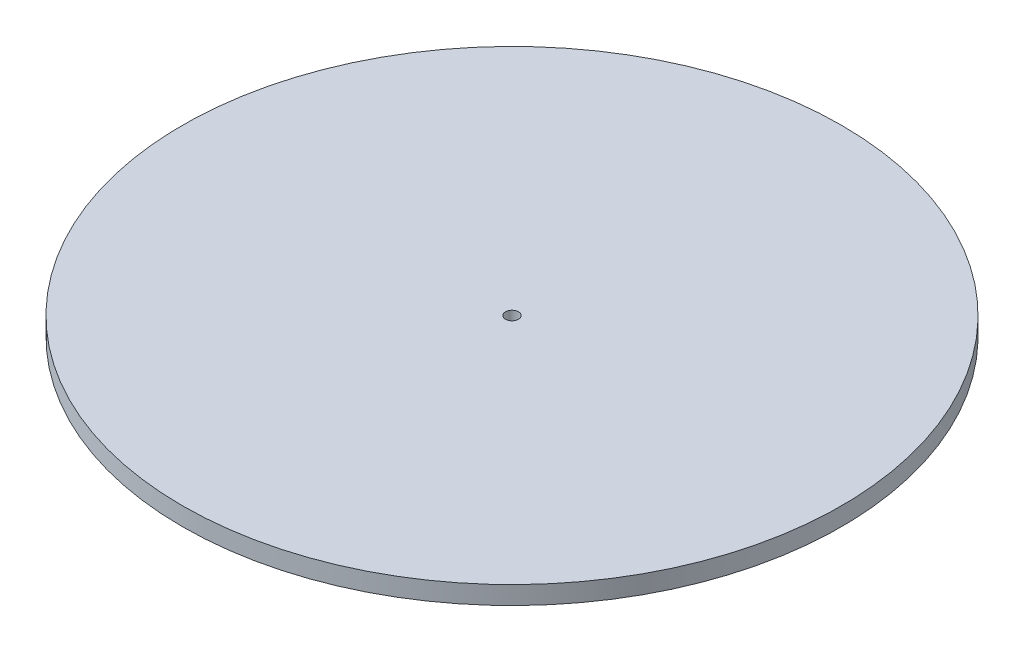
ISO-10303-21;
HEADER;
FILE_DESCRIPTION(('STEP AP214'),'2;1');
FILE_NAME('part.step','',(''),(''),'','','');
FILE_SCHEMA(('AUTOMOTIVE_DESIGN { 1 0 10303 214 1 1 1 1 }'));
ENDSEC;
DATA;
#1=APPLICATION_CONTEXT('core data for automotive mechanical design processes');
#2=APPLICATION_PROTOCOL_DEFINITION('international standard','automotive_design',2000,#1);
#3=PRODUCT_CONTEXT('',#1,'mechanical');
#4=PRODUCT('Part','Part','',(#3));
#5=PRODUCT_RELATED_PRODUCT_CATEGORY('part','',(#4));
#6=PRODUCT_DEFINITION_FORMATION('','',#4);
#7=PRODUCT_DEFINITION_CONTEXT('part definition',#1,'design');
#8=PRODUCT_DEFINITION('design','',#6,#7);
#9=PRODUCT_DEFINITION_SHAPE('','',#8);
#10=(LENGTH_UNIT() NAMED_UNIT(*) SI_UNIT(.MILLI.,.METRE.));
#11=(NAMED_UNIT(*) PLANE_ANGLE_UNIT() SI_UNIT($,.RADIAN.));
#12=(NAMED_UNIT(*) SI_UNIT($,.STERADIAN.) SOLID_ANGLE_UNIT());
#13=UNCERTAINTY_MEASURE_WITH_UNIT(LENGTH_MEASURE(1.E-05),#10,'distance_accuracy_value','');
#14=(GEOMETRIC_REPRESENTATION_CONTEXT(3) GLOBAL_UNCERTAINTY_ASSIGNED_CONTEXT((#13)) GLOBAL_UNIT_ASSIGNED_CONTEXT((#10,
#11,#12)) REPRESENTATION_CONTEXT('',''));
#15=CARTESIAN_POINT('',(0.,0.,0.));
#16=DIRECTION('',(0.,0.,1.));
#17=DIRECTION('',(1.,0.,0.));
#18=AXIS2_PLACEMENT_3D('',#15,#16,#17);
#19=CARTESIAN_POINT('',(0.,7.,0.));
#20=DIRECTION('',(0.,-1.,0.));
#21=DIRECTION('',(0.,0.,-1.));
#22=AXIS2_PLACEMENT_3D('',#19,#20,#21);
#23=CYLINDRICAL_SURFACE('',#22,127.);
#24=CARTESIAN_POINT('',(0.,7.,0.));
#25=DIRECTION('',(0.,1.,0.));
#26=DIRECTION('',(0.,0.,1.));
#27=AXIS2_PLACEMENT_3D('',#24,#25,#26);
#28=CIRCLE('',#27,127.);
#29=CARTESIAN_POINT('',(0.,7.,127.));
#30=VERTEX_POINT('',#29);
#31=EDGE_CURVE('E10',#30,#30,#28,.T.);
#32=ORIENTED_EDGE('',*,*,#31,.F.);
#33=EDGE_LOOP('',(#32));
#34=FACE_BOUND('',#33,.T.);
#35=CARTESIAN_POINT('',(0.,0.,0.));
#36=DIRECTION('',(0.,1.,0.));
#37=DIRECTION('',(0.,0.,1.));
#38=AXIS2_PLACEMENT_3D('',#35,#36,#37);
#39=CIRCLE('',#38,127.);
#40=CARTESIAN_POINT('',(0.,0.,127.));
#41=VERTEX_POINT('',#40);
#42=EDGE_CURVE('E36',#41,#41,#39,.T.);
#43=ORIENTED_EDGE('',*,*,#42,.T.);
#44=EDGE_LOOP('',(#43));
#45=FACE_BOUND('',#44,.T.);
#46=ADVANCED_FACE('F33',(#34,#45),#23,.T.);
#47=CARTESIAN_POINT('',(0.,7.,0.));
#48=DIRECTION('',(0.,1.,0.));
#49=DIRECTION('',(0.,0.,1.));
#50=AXIS2_PLACEMENT_3D('',#47,#48,#49);
#51=PLANE('',#50);
#52=CARTESIAN_POINT('',(0.,7.,0.));
#53=DIRECTION('',(0.,1.,0.));
#54=DIRECTION('',(0.,0.,1.));
#55=AXIS2_PLACEMENT_3D('',#52,#53,#54);
#56=CIRCLE('',#55,2.5);
#57=CARTESIAN_POINT('',(0.,7.,2.5));
#58=VERTEX_POINT('',#57);
#59=EDGE_CURVE('E47',#58,#58,#56,.T.);
#60=ORIENTED_EDGE('',*,*,#59,.F.);
#61=EDGE_LOOP('',(#60));
#62=FACE_BOUND('',#61,.T.);
#63=ORIENTED_EDGE('',*,*,#31,.T.);
#64=EDGE_LOOP('',(#63));
#65=FACE_BOUND('',#64,.T.);
#66=ADVANCED_FACE('F54',(#62,#65),#51,.T.);
#67=CARTESIAN_POINT('',(0.,0.,0.));
#68=DIRECTION('',(0.,1.,0.));
#69=DIRECTION('',(0.,0.,1.));
#70=AXIS2_PLACEMENT_3D('',#67,#68,#69);
#71=PLANE('',#70);
#72=CARTESIAN_POINT('',(0.,0.,0.));
#73=DIRECTION('',(0.,1.,0.));
#74=DIRECTION('',(0.,0.,1.));
#75=AXIS2_PLACEMENT_3D('',#72,#73,#74);
#76=CIRCLE('',#75,2.5);
#77=CARTESIAN_POINT('',(0.,0.,2.5));
#78=VERTEX_POINT('',#77);
#79=EDGE_CURVE('E43',#78,#78,#76,.F.);
#80=ORIENTED_EDGE('',*,*,#79,.F.);
#81=EDGE_LOOP('',(#80));
#82=FACE_BOUND('',#81,.T.);
#83=ORIENTED_EDGE('',*,*,#42,.F.);
#84=EDGE_LOOP('',(#83));
#85=FACE_BOUND('',#84,.T.);
#86=ADVANCED_FACE('F56',(#82,#85),#71,.F.);
#87=CARTESIAN_POINT('',(0.,-0.00100000000000013,0.));
#88=DIRECTION('',(0.,1.,0.));
#89=DIRECTION('',(0.,0.,1.));
#90=AXIS2_PLACEMENT_3D('',#87,#88,#89);
#91=CYLINDRICAL_SURFACE('',#90,2.5);
#92=ORIENTED_EDGE('',*,*,#59,.T.);
#93=EDGE_LOOP('',(#92));
#94=FACE_BOUND('',#93,.T.);
#95=ORIENTED_EDGE('',*,*,#79,.T.);
#96=EDGE_LOOP('',(#95));
#97=FACE_BOUND('',#96,.T.);
#98=ADVANCED_FACE('F51',(#94,#97),#91,.F.);
#99=CLOSED_SHELL('',(#46,#66,#86,#98));
#100=MANIFOLD_SOLID_BREP('B2',#99);
#101=ADVANCED_BREP_SHAPE_REPRESENTATION('',(#18,#100),#14);
#102=SHAPE_DEFINITION_REPRESENTATION(#9,#101);
ENDSEC;
END-ISO-10303-21;
